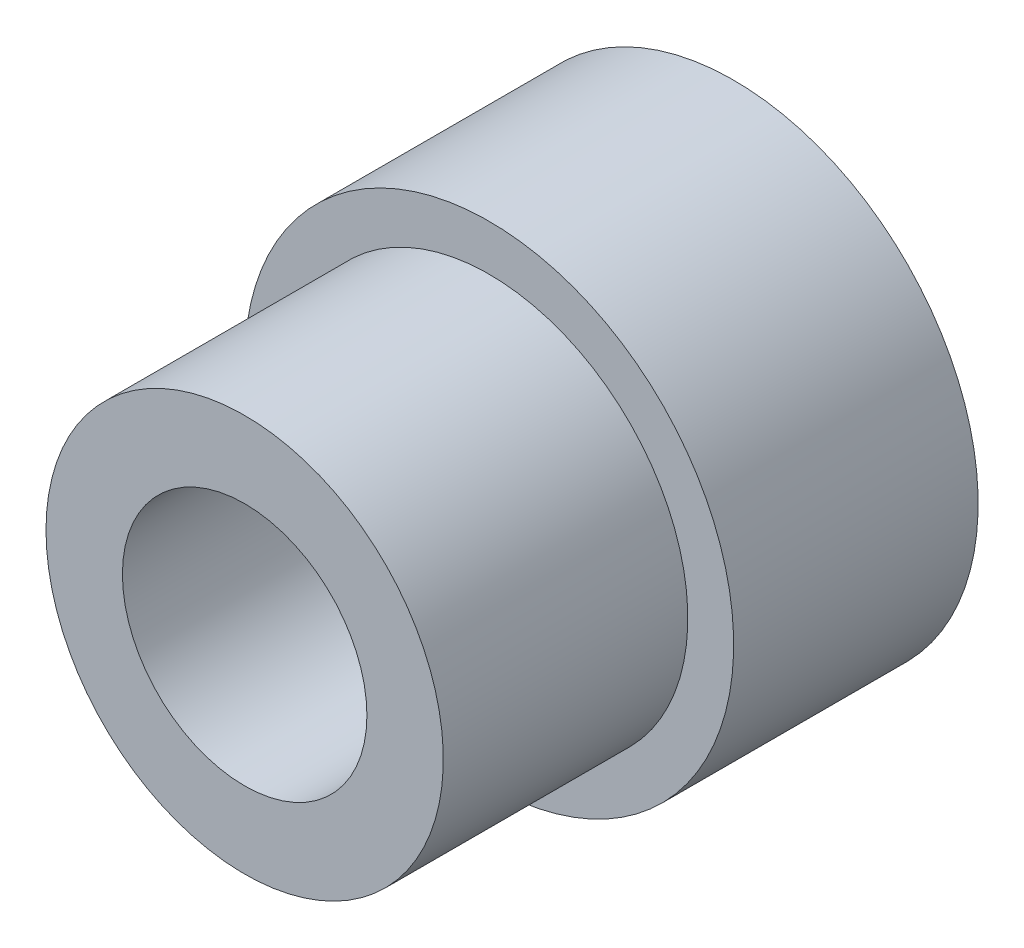
ISO-10303-21;
HEADER;
FILE_DESCRIPTION(('STEP AP214'),'2;1');
FILE_NAME('part.step','',(''),(''),'','','');
FILE_SCHEMA(('AUTOMOTIVE_DESIGN { 1 0 10303 214 1 1 1 1 }'));
ENDSEC;
DATA;
#1=APPLICATION_CONTEXT('core data for automotive mechanical design processes');
#2=APPLICATION_PROTOCOL_DEFINITION('international standard','automotive_design',2000,#1);
#3=PRODUCT_CONTEXT('',#1,'mechanical');
#4=PRODUCT('Part','Part','',(#3));
#5=PRODUCT_RELATED_PRODUCT_CATEGORY('part','',(#4));
#6=PRODUCT_DEFINITION_FORMATION('','',#4);
#7=PRODUCT_DEFINITION_CONTEXT('part definition',#1,'design');
#8=PRODUCT_DEFINITION('design','',#6,#7);
#9=PRODUCT_DEFINITION_SHAPE('','',#8);
#10=(LENGTH_UNIT() NAMED_UNIT(*) SI_UNIT(.MILLI.,.METRE.));
#11=(NAMED_UNIT(*) PLANE_ANGLE_UNIT() SI_UNIT($,.RADIAN.));
#12=(NAMED_UNIT(*) SI_UNIT($,.STERADIAN.) SOLID_ANGLE_UNIT());
#13=UNCERTAINTY_MEASURE_WITH_UNIT(LENGTH_MEASURE(1.E-05),#10,'distance_accuracy_value','');
#14=(GEOMETRIC_REPRESENTATION_CONTEXT(3) GLOBAL_UNCERTAINTY_ASSIGNED_CONTEXT((#13)) GLOBAL_UNIT_ASSIGNED_CONTEXT((#10,
#11,#12)) REPRESENTATION_CONTEXT('',''));
#15=CARTESIAN_POINT('',(0.,0.,0.));
#16=DIRECTION('',(0.,0.,1.));
#17=DIRECTION('',(1.,0.,0.));
#18=AXIS2_PLACEMENT_3D('',#15,#16,#17);
#19=CARTESIAN_POINT('',(0.,0.,9.525));
#20=DIRECTION('',(0.,0.,1.));
#21=DIRECTION('',(1.,0.,0.));
#22=AXIS2_PLACEMENT_3D('',#19,#20,#21);
#23=PLANE('',#22);
#24=CARTESIAN_POINT('',(0.,0.,9.525));
#25=DIRECTION('',(0.,0.,1.));
#26=DIRECTION('',(1.,0.,0.));
#27=AXIS2_PLACEMENT_3D('',#24,#25,#26);
#28=CIRCLE('',#27,9.525);
#29=CARTESIAN_POINT('',(-9.525,0.,9.525));
#30=VERTEX_POINT('',#29);
#31=EDGE_CURVE('E10',#30,#30,#28,.T.);
#32=ORIENTED_EDGE('',*,*,#31,.T.);
#33=EDGE_LOOP('',(#32));
#34=FACE_BOUND('',#33,.T.);
#35=CARTESIAN_POINT('',(0.,0.,9.525));
#36=DIRECTION('',(0.,0.,1.));
#37=DIRECTION('',(1.,0.,0.));
#38=AXIS2_PLACEMENT_3D('',#35,#36,#37);
#39=CIRCLE('',#38,7.7390625);
#40=CARTESIAN_POINT('',(-7.7390625,0.,9.525));
#41=VERTEX_POINT('',#40);
#42=EDGE_CURVE('E44',#41,#41,#39,.T.);
#43=ORIENTED_EDGE('',*,*,#42,.F.);
#44=EDGE_LOOP('',(#43));
#45=FACE_BOUND('',#44,.T.);
#46=ADVANCED_FACE('F31',(#34,#45),#23,.T.);
#47=CARTESIAN_POINT('',(0.,0.,9.525));
#48=DIRECTION('',(0.,0.,-1.));
#49=DIRECTION('',(-1.,0.,0.));
#50=AXIS2_PLACEMENT_3D('',#47,#48,#49);
#51=CYLINDRICAL_SURFACE('',#50,9.525);
#52=CARTESIAN_POINT('',(0.,0.,0.));
#53=DIRECTION('',(0.,0.,1.));
#54=DIRECTION('',(1.,0.,0.));
#55=AXIS2_PLACEMENT_3D('',#52,#53,#54);
#56=CIRCLE('',#55,9.525);
#57=CARTESIAN_POINT('',(-9.525,0.,0.));
#58=VERTEX_POINT('',#57);
#59=EDGE_CURVE('E35',#58,#58,#56,.T.);
#60=CARTESIAN_POINT('',(-9.525,0.,9.525));
#61=CARTESIAN_POINT('',(-9.525,0.,9.42578125));
#62=CARTESIAN_POINT('',(-9.525,0.,9.3265625));
#63=CARTESIAN_POINT('',(-9.525,0.,9.128125));
#64=CARTESIAN_POINT('',(-9.525,0.,9.02890625));
#65=CARTESIAN_POINT('',(-9.525,0.,8.83046875));
#66=CARTESIAN_POINT('',(-9.525,0.,8.73125));
#67=CARTESIAN_POINT('',(-9.525,0.,8.5328125));
#68=CARTESIAN_POINT('',(-9.525,0.,8.43359375));
#69=CARTESIAN_POINT('',(-9.525,0.,8.23515625));
#70=CARTESIAN_POINT('',(-9.525,0.,8.1359375));
#71=CARTESIAN_POINT('',(-9.525,0.,7.9375));
#72=CARTESIAN_POINT('',(-9.525,0.,7.83828125));
#73=CARTESIAN_POINT('',(-9.525,0.,7.63984375));
#74=CARTESIAN_POINT('',(-9.525,0.,7.540625));
#75=CARTESIAN_POINT('',(-9.525,0.,7.3421875));
#76=CARTESIAN_POINT('',(-9.525,0.,7.24296875));
#77=CARTESIAN_POINT('',(-9.525,0.,7.04453125));
#78=CARTESIAN_POINT('',(-9.525,0.,6.9453125));
#79=CARTESIAN_POINT('',(-9.525,0.,6.746875));
#80=CARTESIAN_POINT('',(-9.525,0.,6.64765625));
#81=CARTESIAN_POINT('',(-9.525,0.,6.44921875));
#82=CARTESIAN_POINT('',(-9.525,0.,6.35));
#83=CARTESIAN_POINT('',(-9.525,0.,6.1515625));
#84=CARTESIAN_POINT('',(-9.525,0.,6.05234375));
#85=CARTESIAN_POINT('',(-9.525,0.,5.85390625));
#86=CARTESIAN_POINT('',(-9.525,0.,5.7546875));
#87=CARTESIAN_POINT('',(-9.525,0.,5.55625));
#88=CARTESIAN_POINT('',(-9.525,0.,5.45703125));
#89=CARTESIAN_POINT('',(-9.525,0.,5.25859375));
#90=CARTESIAN_POINT('',(-9.525,0.,5.159375));
#91=CARTESIAN_POINT('',(-9.525,0.,4.9609375));
#92=CARTESIAN_POINT('',(-9.525,0.,4.86171875));
#93=CARTESIAN_POINT('',(-9.525,0.,4.66328125));
#94=CARTESIAN_POINT('',(-9.525,0.,4.5640625));
#95=CARTESIAN_POINT('',(-9.525,0.,4.365625));
#96=CARTESIAN_POINT('',(-9.525,0.,4.26640625));
#97=CARTESIAN_POINT('',(-9.525,0.,4.06796875));
#98=CARTESIAN_POINT('',(-9.525,0.,3.96875));
#99=CARTESIAN_POINT('',(-9.525,0.,3.7703125));
#100=CARTESIAN_POINT('',(-9.525,0.,3.67109375));
#101=CARTESIAN_POINT('',(-9.525,0.,3.47265625));
#102=CARTESIAN_POINT('',(-9.525,0.,3.3734375));
#103=CARTESIAN_POINT('',(-9.525,0.,3.175));
#104=CARTESIAN_POINT('',(-9.525,0.,3.07578125));
#105=CARTESIAN_POINT('',(-9.525,0.,2.87734375));
#106=CARTESIAN_POINT('',(-9.525,0.,2.778125));
#107=CARTESIAN_POINT('',(-9.525,0.,2.5796875));
#108=CARTESIAN_POINT('',(-9.525,0.,2.48046875));
#109=CARTESIAN_POINT('',(-9.525,0.,2.28203125));
#110=CARTESIAN_POINT('',(-9.525,0.,2.1828125));
#111=CARTESIAN_POINT('',(-9.525,0.,1.984375));
#112=CARTESIAN_POINT('',(-9.525,0.,1.88515625));
#113=CARTESIAN_POINT('',(-9.525,0.,1.68671875));
#114=CARTESIAN_POINT('',(-9.525,0.,1.5875));
#115=CARTESIAN_POINT('',(-9.525,0.,1.3890625));
#116=CARTESIAN_POINT('',(-9.525,0.,1.28984375));
#117=CARTESIAN_POINT('',(-9.525,0.,1.09140625));
#118=CARTESIAN_POINT('',(-9.525,0.,0.992187500000001));
#119=CARTESIAN_POINT('',(-9.525,0.,0.793750000000001));
#120=CARTESIAN_POINT('',(-9.525,0.,0.69453125));
#121=CARTESIAN_POINT('',(-9.525,0.,0.49609375));
#122=CARTESIAN_POINT('',(-9.525,0.,0.396875));
#123=CARTESIAN_POINT('',(-9.525,0.,0.1984375));
#124=CARTESIAN_POINT('',(-9.525,0.,0.0992187500000001));
#125=CARTESIAN_POINT('',(-9.525,0.,0.));
#126=B_SPLINE_CURVE_WITH_KNOTS('',3,(#60,#61,#62,#63,#64,#65,#66,#67,#68,#69,#70,#71,#72,#73,
#74,#75,#76,#77,#78,#79,#80,#81,#82,#83,#84,#85,#86,#87,#88,#89,#90,#91,#92,#93,#94,#95,#96,#97,
#98,#99,#100,#101,#102,#103,#104,#105,#106,#107,#108,#109,#110,#111,#112,#113,#114,#115,#116,
#117,#118,#119,#120,#121,#122,#123,#124,#125),.UNSPECIFIED.,.F.,.F.,(4,2,2,2,2,2,2,2,2,2,2,2,2,
2,2,2,2,2,2,2,2,2,2,2,2,2,2,2,2,2,2,2,4),(0.,0.29765625,0.5953125,0.892968750000001,1.190625,
1.48828125,1.7859375,2.08359375,2.38125,2.67890625,2.9765625,3.27421875,3.571875,3.86953125,
4.1671875,4.46484375,4.7625,5.06015625,5.3578125,5.65546875,5.953125,6.25078125,6.5484375,
6.84609375,7.14375,7.44140625,7.7390625,8.03671875,8.334375,8.63203125,8.9296875,9.22734375,
9.525),.UNSPECIFIED.);
#127=EDGE_CURVE('BSEAM33',#30,#58,#126,.T.);
#128=ORIENTED_EDGE('',*,*,#31,.F.);
#129=ORIENTED_EDGE('',*,*,#59,.T.);
#130=ORIENTED_EDGE('',*,*,#127,.T.);
#131=ORIENTED_EDGE('',*,*,#127,.F.);
#132=EDGE_LOOP('',(#128,#130,#129,#131));
#133=FACE_BOUND('',#132,.T.);
#134=ADVANCED_FACE('F33',(#133),#51,.T.);
#135=CARTESIAN_POINT('',(0.,0.,0.));
#136=DIRECTION('',(0.,0.,1.));
#137=DIRECTION('',(1.,0.,0.));
#138=AXIS2_PLACEMENT_3D('',#135,#136,#137);
#139=PLANE('',#138);
#140=CARTESIAN_POINT('',(0.,0.,0.));
#141=DIRECTION('',(0.,0.,1.));
#142=DIRECTION('',(1.,0.,0.));
#143=AXIS2_PLACEMENT_3D('',#140,#141,#142);
#144=CIRCLE('',#143,4.7625);
#145=CARTESIAN_POINT('',(4.7625,0.,0.));
#146=VERTEX_POINT('',#145);
#147=EDGE_CURVE('E47',#146,#146,#144,.T.);
#148=ORIENTED_EDGE('',*,*,#147,.T.);
#149=EDGE_LOOP('',(#148));
#150=FACE_BOUND('',#149,.T.);
#151=ORIENTED_EDGE('',*,*,#59,.F.);
#152=EDGE_LOOP('',(#151));
#153=FACE_BOUND('',#152,.T.);
#154=ADVANCED_FACE('F56',(#150,#153),#139,.F.);
#155=CARTESIAN_POINT('',(0.,0.,19.05));
#156=DIRECTION('',(0.,0.,-1.));
#157=DIRECTION('',(-1.,0.,0.));
#158=AXIS2_PLACEMENT_3D('',#155,#156,#157);
#159=CYLINDRICAL_SURFACE('',#158,7.7390625);
#160=CARTESIAN_POINT('',(0.,0.,19.05));
#161=DIRECTION('',(0.,0.,1.));
#162=DIRECTION('',(1.,0.,0.));
#163=AXIS2_PLACEMENT_3D('',#160,#161,#162);
#164=CIRCLE('',#163,7.7390625);
#165=CARTESIAN_POINT('',(-7.7390625,0.,19.05));
#166=VERTEX_POINT('',#165);
#167=EDGE_CURVE('E42',#166,#166,#164,.T.);
#168=CARTESIAN_POINT('',(-7.7390625,0.,19.05));
#169=CARTESIAN_POINT('',(-7.7390625,0.,18.95078125));
#170=CARTESIAN_POINT('',(-7.7390625,0.,18.8515625));
#171=CARTESIAN_POINT('',(-7.7390625,0.,18.653125));
#172=CARTESIAN_POINT('',(-7.7390625,0.,18.55390625));
#173=CARTESIAN_POINT('',(-7.7390625,0.,18.35546875));
#174=CARTESIAN_POINT('',(-7.7390625,0.,18.25625));
#175=CARTESIAN_POINT('',(-7.7390625,0.,18.0578125));
#176=CARTESIAN_POINT('',(-7.7390625,0.,17.95859375));
#177=CARTESIAN_POINT('',(-7.7390625,0.,17.76015625));
#178=CARTESIAN_POINT('',(-7.7390625,0.,17.6609375));
#179=CARTESIAN_POINT('',(-7.7390625,0.,17.4625));
#180=CARTESIAN_POINT('',(-7.7390625,0.,17.36328125));
#181=CARTESIAN_POINT('',(-7.7390625,0.,17.16484375));
#182=CARTESIAN_POINT('',(-7.7390625,0.,17.065625));
#183=CARTESIAN_POINT('',(-7.7390625,0.,16.8671875));
#184=CARTESIAN_POINT('',(-7.7390625,0.,16.76796875));
#185=CARTESIAN_POINT('',(-7.7390625,0.,16.56953125));
#186=CARTESIAN_POINT('',(-7.7390625,0.,16.4703125));
#187=CARTESIAN_POINT('',(-7.7390625,0.,16.271875));
#188=CARTESIAN_POINT('',(-7.7390625,0.,16.17265625));
#189=CARTESIAN_POINT('',(-7.7390625,0.,15.97421875));
#190=CARTESIAN_POINT('',(-7.7390625,0.,15.875));
#191=CARTESIAN_POINT('',(-7.7390625,0.,15.6765625));
#192=CARTESIAN_POINT('',(-7.7390625,0.,15.57734375));
#193=CARTESIAN_POINT('',(-7.7390625,0.,15.37890625));
#194=CARTESIAN_POINT('',(-7.7390625,0.,15.2796875));
#195=CARTESIAN_POINT('',(-7.7390625,0.,15.08125));
#196=CARTESIAN_POINT('',(-7.7390625,0.,14.98203125));
#197=CARTESIAN_POINT('',(-7.7390625,0.,14.78359375));
#198=CARTESIAN_POINT('',(-7.7390625,0.,14.684375));
#199=CARTESIAN_POINT('',(-7.7390625,0.,14.4859375));
#200=CARTESIAN_POINT('',(-7.7390625,0.,14.38671875));
#201=CARTESIAN_POINT('',(-7.7390625,0.,14.18828125));
#202=CARTESIAN_POINT('',(-7.7390625,0.,14.0890625));
#203=CARTESIAN_POINT('',(-7.7390625,0.,13.890625));
#204=CARTESIAN_POINT('',(-7.7390625,0.,13.79140625));
#205=CARTESIAN_POINT('',(-7.7390625,0.,13.59296875));
#206=CARTESIAN_POINT('',(-7.7390625,0.,13.49375));
#207=CARTESIAN_POINT('',(-7.7390625,0.,13.2953125));
#208=CARTESIAN_POINT('',(-7.7390625,0.,13.19609375));
#209=CARTESIAN_POINT('',(-7.7390625,0.,12.99765625));
#210=CARTESIAN_POINT('',(-7.7390625,0.,12.8984375));
#211=CARTESIAN_POINT('',(-7.7390625,0.,12.7));
#212=CARTESIAN_POINT('',(-7.7390625,0.,12.60078125));
#213=CARTESIAN_POINT('',(-7.7390625,0.,12.40234375));
#214=CARTESIAN_POINT('',(-7.7390625,0.,12.303125));
#215=CARTESIAN_POINT('',(-7.7390625,0.,12.1046875));
#216=CARTESIAN_POINT('',(-7.7390625,0.,12.00546875));
#217=CARTESIAN_POINT('',(-7.7390625,0.,11.80703125));
#218=CARTESIAN_POINT('',(-7.7390625,0.,11.7078125));
#219=CARTESIAN_POINT('',(-7.7390625,0.,11.509375));
#220=CARTESIAN_POINT('',(-7.7390625,0.,11.41015625));
#221=CARTESIAN_POINT('',(-7.7390625,0.,11.21171875));
#222=CARTESIAN_POINT('',(-7.7390625,0.,11.1125));
#223=CARTESIAN_POINT('',(-7.7390625,0.,10.9140625));
#224=CARTESIAN_POINT('',(-7.7390625,0.,10.81484375));
#225=CARTESIAN_POINT('',(-7.7390625,0.,10.61640625));
#226=CARTESIAN_POINT('',(-7.7390625,0.,10.5171875));
#227=CARTESIAN_POINT('',(-7.7390625,0.,10.31875));
#228=CARTESIAN_POINT('',(-7.7390625,0.,10.21953125));
#229=CARTESIAN_POINT('',(-7.7390625,0.,10.02109375));
#230=CARTESIAN_POINT('',(-7.7390625,0.,9.921875));
#231=CARTESIAN_POINT('',(-7.7390625,0.,9.7234375));
#232=CARTESIAN_POINT('',(-7.7390625,0.,9.62421875));
#233=CARTESIAN_POINT('',(-7.7390625,0.,9.525));
#234=B_SPLINE_CURVE_WITH_KNOTS('',3,(#168,#169,#170,#171,#172,#173,#174,#175,#176,#177,#178,
#179,#180,#181,#182,#183,#184,#185,#186,#187,#188,#189,#190,#191,#192,#193,#194,#195,#196,#197,
#198,#199,#200,#201,#202,#203,#204,#205,#206,#207,#208,#209,#210,#211,#212,#213,#214,#215,#216,
#217,#218,#219,#220,#221,#222,#223,#224,#225,#226,#227,#228,#229,#230,#231,#232,#233),
.UNSPECIFIED.,.F.,.F.,(4,2,2,2,2,2,2,2,2,2,2,2,2,2,2,2,2,2,2,2,2,2,2,2,2,2,2,2,2,2,2,2,4),(0.,
0.29765625,0.5953125,0.892968750000001,1.190625,1.48828125,1.7859375,2.08359375,2.38125,
2.67890625,2.9765625,3.27421875,3.571875,3.86953125,4.1671875,4.46484375,4.7625,5.06015625,
5.3578125,5.65546875,5.953125,6.25078125,6.5484375,6.84609375,7.14375,7.44140625,7.7390625,
8.03671875,8.334375,8.63203125,8.9296875,9.22734375,9.525),.UNSPECIFIED.);
#235=EDGE_CURVE('BSEAM68',#166,#41,#234,.T.);
#236=ORIENTED_EDGE('',*,*,#167,.F.);
#237=ORIENTED_EDGE('',*,*,#42,.T.);
#238=ORIENTED_EDGE('',*,*,#235,.T.);
#239=ORIENTED_EDGE('',*,*,#235,.F.);
#240=EDGE_LOOP('',(#236,#238,#237,#239));
#241=FACE_BOUND('',#240,.T.);
#242=ADVANCED_FACE('F68',(#241),#159,.T.);
#243=CARTESIAN_POINT('',(0.,0.,19.05));
#244=DIRECTION('',(0.,0.,1.));
#245=DIRECTION('',(1.,0.,0.));
#246=AXIS2_PLACEMENT_3D('',#243,#244,#245);
#247=PLANE('',#246);
#248=CARTESIAN_POINT('',(0.,0.,19.05));
#249=DIRECTION('',(0.,0.,1.));
#250=DIRECTION('',(1.,0.,0.));
#251=AXIS2_PLACEMENT_3D('',#248,#249,#250);
#252=CIRCLE('',#251,4.7625);
#253=CARTESIAN_POINT('',(4.7625,0.,19.05));
#254=VERTEX_POINT('',#253);
#255=EDGE_CURVE('E50',#254,#254,#252,.T.);
#256=ORIENTED_EDGE('',*,*,#255,.F.);
#257=EDGE_LOOP('',(#256));
#258=FACE_BOUND('',#257,.T.);
#259=ORIENTED_EDGE('',*,*,#167,.T.);
#260=EDGE_LOOP('',(#259));
#261=FACE_BOUND('',#260,.T.);
#262=ADVANCED_FACE('F62',(#258,#261),#247,.T.);
#263=CARTESIAN_POINT('',(0.,0.,0.));
#264=DIRECTION('',(0.,0.,1.));
#265=DIRECTION('',(1.,0.,0.));
#266=AXIS2_PLACEMENT_3D('',#263,#264,#265);
#267=CYLINDRICAL_SURFACE('',#266,4.7625);
#268=CARTESIAN_POINT('',(4.7625,0.,0.));
#269=CARTESIAN_POINT('',(4.7625,0.,0.1984375));
#270=CARTESIAN_POINT('',(4.7625,0.,0.396875));
#271=CARTESIAN_POINT('',(4.7625,0.,0.79375));
#272=CARTESIAN_POINT('',(4.7625,0.,0.9921875));
#273=CARTESIAN_POINT('',(4.7625,0.,1.3890625));
#274=CARTESIAN_POINT('',(4.7625,0.,1.5875));
#275=CARTESIAN_POINT('',(4.7625,0.,1.984375));
#276=CARTESIAN_POINT('',(4.7625,0.,2.1828125));
#277=CARTESIAN_POINT('',(4.7625,0.,2.5796875));
#278=CARTESIAN_POINT('',(4.7625,0.,2.778125));
#279=CARTESIAN_POINT('',(4.7625,0.,3.175));
#280=CARTESIAN_POINT('',(4.7625,0.,3.3734375));
#281=CARTESIAN_POINT('',(4.7625,0.,3.7703125));
#282=CARTESIAN_POINT('',(4.7625,0.,3.96875));
#283=CARTESIAN_POINT('',(4.7625,0.,4.365625));
#284=CARTESIAN_POINT('',(4.7625,0.,4.5640625));
#285=CARTESIAN_POINT('',(4.7625,0.,4.9609375));
#286=CARTESIAN_POINT('',(4.7625,0.,5.159375));
#287=CARTESIAN_POINT('',(4.7625,0.,5.55625));
#288=CARTESIAN_POINT('',(4.7625,0.,5.7546875));
#289=CARTESIAN_POINT('',(4.7625,0.,6.1515625));
#290=CARTESIAN_POINT('',(4.7625,0.,6.35));
#291=CARTESIAN_POINT('',(4.7625,0.,6.746875));
#292=CARTESIAN_POINT('',(4.7625,0.,6.9453125));
#293=CARTESIAN_POINT('',(4.7625,0.,7.3421875));
#294=CARTESIAN_POINT('',(4.7625,0.,7.540625));
#295=CARTESIAN_POINT('',(4.7625,0.,7.9375));
#296=CARTESIAN_POINT('',(4.7625,0.,8.1359375));
#297=CARTESIAN_POINT('',(4.7625,0.,8.5328125));
#298=CARTESIAN_POINT('',(4.7625,0.,8.73125));
#299=CARTESIAN_POINT('',(4.7625,0.,9.128125));
#300=CARTESIAN_POINT('',(4.7625,0.,9.3265625));
#301=CARTESIAN_POINT('',(4.7625,0.,9.7234375));
#302=CARTESIAN_POINT('',(4.7625,0.,9.921875));
#303=CARTESIAN_POINT('',(4.7625,0.,10.31875));
#304=CARTESIAN_POINT('',(4.7625,0.,10.5171875));
#305=CARTESIAN_POINT('',(4.7625,0.,10.9140625));
#306=CARTESIAN_POINT('',(4.7625,0.,11.1125));
#307=CARTESIAN_POINT('',(4.7625,0.,11.509375));
#308=CARTESIAN_POINT('',(4.7625,0.,11.7078125));
#309=CARTESIAN_POINT('',(4.7625,0.,12.1046875));
#310=CARTESIAN_POINT('',(4.7625,0.,12.303125));
#311=CARTESIAN_POINT('',(4.7625,0.,12.7));
#312=CARTESIAN_POINT('',(4.7625,0.,12.8984375));
#313=CARTESIAN_POINT('',(4.7625,0.,13.2953125));
#314=CARTESIAN_POINT('',(4.7625,0.,13.49375));
#315=CARTESIAN_POINT('',(4.7625,0.,13.890625));
#316=CARTESIAN_POINT('',(4.7625,0.,14.0890625));
#317=CARTESIAN_POINT('',(4.7625,0.,14.4859375));
#318=CARTESIAN_POINT('',(4.7625,0.,14.684375));
#319=CARTESIAN_POINT('',(4.7625,0.,15.08125));
#320=CARTESIAN_POINT('',(4.7625,0.,15.2796875));
#321=CARTESIAN_POINT('',(4.7625,0.,15.6765625));
#322=CARTESIAN_POINT('',(4.7625,0.,15.875));
#323=CARTESIAN_POINT('',(4.7625,0.,16.271875));
#324=CARTESIAN_POINT('',(4.7625,0.,16.4703125));
#325=CARTESIAN_POINT('',(4.7625,0.,16.8671875));
#326=CARTESIAN_POINT('',(4.7625,0.,17.065625));
#327=CARTESIAN_POINT('',(4.7625,0.,17.4625));
#328=CARTESIAN_POINT('',(4.7625,0.,17.6609375));
#329=CARTESIAN_POINT('',(4.7625,0.,18.0578125));
#330=CARTESIAN_POINT('',(4.7625,0.,18.25625));
#331=CARTESIAN_POINT('',(4.7625,0.,18.653125));
#332=CARTESIAN_POINT('',(4.7625,0.,18.8515625));
#333=CARTESIAN_POINT('',(4.7625,0.,19.05));
#334=B_SPLINE_CURVE_WITH_KNOTS('',3,(#268,#269,#270,#271,#272,#273,#274,#275,#276,#277,#278,
#279,#280,#281,#282,#283,#284,#285,#286,#287,#288,#289,#290,#291,#292,#293,#294,#295,#296,#297,
#298,#299,#300,#301,#302,#303,#304,#305,#306,#307,#308,#309,#310,#311,#312,#313,#314,#315,#316,
#317,#318,#319,#320,#321,#322,#323,#324,#325,#326,#327,#328,#329,#330,#331,#332,#333),
.UNSPECIFIED.,.F.,.F.,(4,2,2,2,2,2,2,2,2,2,2,2,2,2,2,2,2,2,2,2,2,2,2,2,2,2,2,2,2,2,2,2,4),(0.,
0.5953125,1.190625,1.7859375,2.38125,2.9765625,3.571875,4.1671875,4.7625,5.3578125,5.953125,
6.5484375,7.14375,7.7390625,8.334375,8.9296875,9.525,10.1203125,10.715625,11.3109375,11.90625,
12.5015625,13.096875,13.6921875,14.2875,14.8828125,15.478125,16.0734375,16.66875,17.2640625,
17.859375,18.4546875,19.05),.UNSPECIFIED.);
#335=EDGE_CURVE('BSEAM59',#146,#254,#334,.T.);
#336=ORIENTED_EDGE('',*,*,#147,.F.);
#337=ORIENTED_EDGE('',*,*,#255,.T.);
#338=ORIENTED_EDGE('',*,*,#335,.T.);
#339=ORIENTED_EDGE('',*,*,#335,.F.);
#340=EDGE_LOOP('',(#336,#338,#337,#339));
#341=FACE_BOUND('',#340,.T.);
#342=ADVANCED_FACE('F59',(#341),#267,.F.);
#343=CLOSED_SHELL('',(#46,#134,#154,#242,#262,#342));
#344=MANIFOLD_SOLID_BREP('B2',#343);
#345=ADVANCED_BREP_SHAPE_REPRESENTATION('',(#18,#344),#14);
#346=SHAPE_DEFINITION_REPRESENTATION(#9,#345);
ENDSEC;
END-ISO-10303-21;
